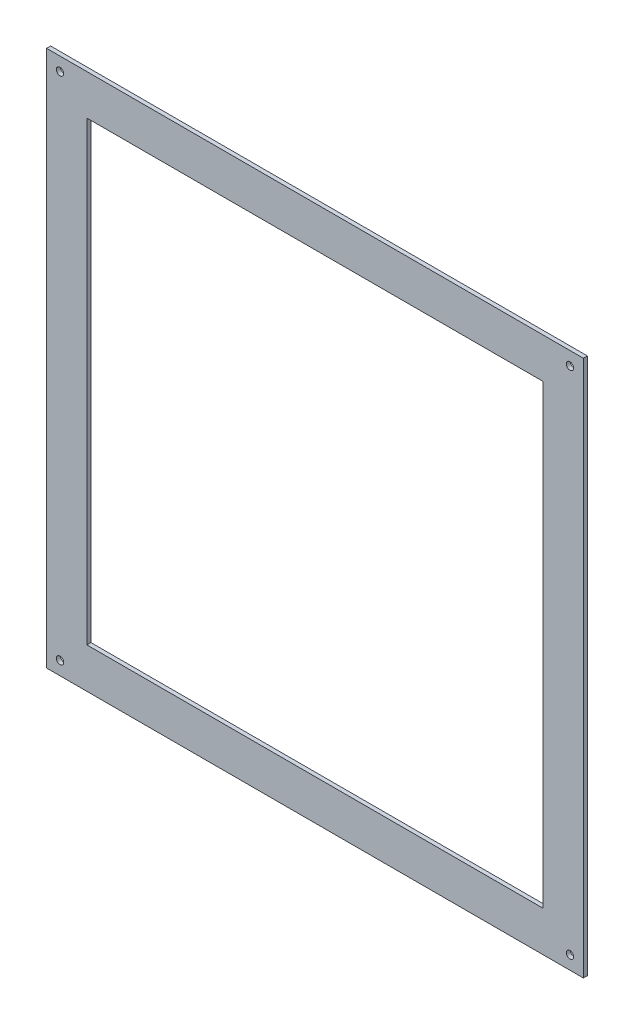
ISO-10303-21;
HEADER;
FILE_DESCRIPTION(('STEP AP214'),'2;1');
FILE_NAME('part.step','',(''),(''),'','','');
FILE_SCHEMA(('AUTOMOTIVE_DESIGN { 1 0 10303 214 1 1 1 1 }'));
ENDSEC;
DATA;
#1=APPLICATION_CONTEXT('core data for automotive mechanical design processes');
#2=APPLICATION_PROTOCOL_DEFINITION('international standard','automotive_design',2000,#1);
#3=PRODUCT_CONTEXT('',#1,'mechanical');
#4=PRODUCT('Part','Part','',(#3));
#5=PRODUCT_RELATED_PRODUCT_CATEGORY('part','',(#4));
#6=PRODUCT_DEFINITION_FORMATION('','',#4);
#7=PRODUCT_DEFINITION_CONTEXT('part definition',#1,'design');
#8=PRODUCT_DEFINITION('design','',#6,#7);
#9=PRODUCT_DEFINITION_SHAPE('','',#8);
#10=(LENGTH_UNIT() NAMED_UNIT(*) SI_UNIT(.MILLI.,.METRE.));
#11=(NAMED_UNIT(*) PLANE_ANGLE_UNIT() SI_UNIT($,.RADIAN.));
#12=(NAMED_UNIT(*) SI_UNIT($,.STERADIAN.) SOLID_ANGLE_UNIT());
#13=UNCERTAINTY_MEASURE_WITH_UNIT(LENGTH_MEASURE(1.E-05),#10,'distance_accuracy_value','');
#14=(GEOMETRIC_REPRESENTATION_CONTEXT(3) GLOBAL_UNCERTAINTY_ASSIGNED_CONTEXT((#13)) GLOBAL_UNIT_ASSIGNED_CONTEXT((#10,
#11,#12)) REPRESENTATION_CONTEXT('',''));
#15=CARTESIAN_POINT('',(0.,0.,0.));
#16=DIRECTION('',(0.,0.,1.));
#17=DIRECTION('',(1.,0.,0.));
#18=AXIS2_PLACEMENT_3D('',#15,#16,#17);
#19=CARTESIAN_POINT('',(0.,0.,3.));
#20=DIRECTION('',(0.,0.,1.));
#21=DIRECTION('',(1.,0.,0.));
#22=AXIS2_PLACEMENT_3D('',#19,#20,#21);
#23=PLANE('',#22);
#24=CARTESIAN_POINT('',(-190.,-190.,3.));
#25=DIRECTION('',(0.,0.,1.));
#26=DIRECTION('',(1.,0.,0.));
#27=AXIS2_PLACEMENT_3D('',#24,#25,#26);
#28=CIRCLE('',#27,2.74999999999997);
#29=CARTESIAN_POINT('',(-187.25,-190.,3.));
#30=VERTEX_POINT('',#29);
#31=EDGE_CURVE('E249',#30,#30,#28,.T.);
#32=ORIENTED_EDGE('',*,*,#31,.F.);
#33=EDGE_LOOP('',(#32));
#34=FACE_BOUND('',#33,.T.);
#35=CARTESIAN_POINT('',(-190.,190.,3.));
#36=DIRECTION('',(0.,0.,1.));
#37=DIRECTION('',(1.,0.,0.));
#38=AXIS2_PLACEMENT_3D('',#35,#36,#37);
#39=CIRCLE('',#38,2.74999999999997);
#40=CARTESIAN_POINT('',(-187.25,190.,3.));
#41=VERTEX_POINT('',#40);
#42=EDGE_CURVE('E251',#41,#41,#39,.T.);
#43=ORIENTED_EDGE('',*,*,#42,.F.);
#44=EDGE_LOOP('',(#43));
#45=FACE_BOUND('',#44,.T.);
#46=CARTESIAN_POINT('',(190.,190.,3.));
#47=DIRECTION('',(0.,0.,1.));
#48=DIRECTION('',(1.,0.,0.));
#49=AXIS2_PLACEMENT_3D('',#46,#47,#48);
#50=CIRCLE('',#49,2.75);
#51=CARTESIAN_POINT('',(192.75,190.,3.));
#52=VERTEX_POINT('',#51);
#53=EDGE_CURVE('E259',#52,#52,#50,.T.);
#54=ORIENTED_EDGE('',*,*,#53,.F.);
#55=EDGE_LOOP('',(#54));
#56=FACE_BOUND('',#55,.T.);
#57=CARTESIAN_POINT('',(190.,-190.,3.));
#58=DIRECTION('',(0.,0.,1.));
#59=DIRECTION('',(1.,0.,0.));
#60=AXIS2_PLACEMENT_3D('',#57,#58,#59);
#61=CIRCLE('',#60,2.75);
#62=CARTESIAN_POINT('',(192.75,-190.,3.));
#63=VERTEX_POINT('',#62);
#64=EDGE_CURVE('E265',#63,#63,#61,.T.);
#65=ORIENTED_EDGE('',*,*,#64,.F.);
#66=EDGE_LOOP('',(#65));
#67=FACE_BOUND('',#66,.T.);
#68=DIRECTION('',(0.,1.,0.));
#69=VECTOR('',#68,1.);
#70=CARTESIAN_POINT('',(200.,200.,3.));
#71=LINE('',#70,#69);
#72=CARTESIAN_POINT('',(200.,-200.,3.));
#73=VERTEX_POINT('',#72);
#74=CARTESIAN_POINT('',(200.,200.,3.));
#75=VERTEX_POINT('',#74);
#76=EDGE_CURVE('E147',#73,#75,#71,.T.);
#77=ORIENTED_EDGE('',*,*,#76,.T.);
#78=DIRECTION('',(-1.,0.,0.));
#79=VECTOR('',#78,1.);
#80=CARTESIAN_POINT('',(-200.,200.,3.));
#81=LINE('',#80,#79);
#82=CARTESIAN_POINT('',(-200.,200.,3.));
#83=VERTEX_POINT('',#82);
#84=EDGE_CURVE('E150',#75,#83,#81,.T.);
#85=ORIENTED_EDGE('',*,*,#84,.T.);
#86=DIRECTION('',(0.,-1.,0.));
#87=VECTOR('',#86,1.);
#88=CARTESIAN_POINT('',(-200.,200.,3.));
#89=LINE('',#88,#87);
#90=CARTESIAN_POINT('',(-200.,-200.,3.));
#91=VERTEX_POINT('',#90);
#92=EDGE_CURVE('E153',#83,#91,#89,.T.);
#93=ORIENTED_EDGE('',*,*,#92,.T.);
#94=DIRECTION('',(1.,0.,0.));
#95=VECTOR('',#94,1.);
#96=CARTESIAN_POINT('',(-200.,-200.,3.));
#97=LINE('',#96,#95);
#98=EDGE_CURVE('E155',#91,#73,#97,.T.);
#99=ORIENTED_EDGE('',*,*,#98,.T.);
#100=EDGE_LOOP('',(#77,#85,#93,#99));
#101=FACE_BOUND('',#100,.T.);
#102=DIRECTION('',(1.,0.,0.));
#103=VECTOR('',#102,1.);
#104=CARTESIAN_POINT('',(170.,-170.,3.));
#105=LINE('',#104,#103);
#106=CARTESIAN_POINT('',(-170.,-170.,3.));
#107=VERTEX_POINT('',#106);
#108=CARTESIAN_POINT('',(170.,-170.,3.));
#109=VERTEX_POINT('',#108);
#110=EDGE_CURVE('E117',#107,#109,#105,.T.);
#111=ORIENTED_EDGE('',*,*,#110,.F.);
#112=DIRECTION('',(0.,-1.,0.));
#113=VECTOR('',#112,1.);
#114=CARTESIAN_POINT('',(-170.,170.,3.));
#115=LINE('',#114,#113);
#116=CARTESIAN_POINT('',(-170.,170.,3.));
#117=VERTEX_POINT('',#116);
#118=EDGE_CURVE('E109',#117,#107,#115,.T.);
#119=ORIENTED_EDGE('',*,*,#118,.F.);
#120=DIRECTION('',(-1.,0.,0.));
#121=VECTOR('',#120,1.);
#122=CARTESIAN_POINT('',(170.,170.,3.));
#123=LINE('',#122,#121);
#124=CARTESIAN_POINT('',(170.,170.,3.));
#125=VERTEX_POINT('',#124);
#126=EDGE_CURVE('E131',#125,#117,#123,.T.);
#127=ORIENTED_EDGE('',*,*,#126,.F.);
#128=DIRECTION('',(0.,1.,0.));
#129=VECTOR('',#128,1.);
#130=CARTESIAN_POINT('',(170.,170.,3.));
#131=LINE('',#130,#129);
#132=EDGE_CURVE('E129',#109,#125,#131,.T.);
#133=ORIENTED_EDGE('',*,*,#132,.F.);
#134=EDGE_LOOP('',(#111,#119,#127,#133));
#135=FACE_BOUND('',#134,.T.);
#136=ADVANCED_FACE('F44',(#34,#45,#56,#67,#101,#135),#23,.T.);
#137=CARTESIAN_POINT('',(0.,0.,0.));
#138=DIRECTION('',(0.,0.,1.));
#139=DIRECTION('',(1.,0.,0.));
#140=AXIS2_PLACEMENT_3D('',#137,#138,#139);
#141=PLANE('',#140);
#142=CARTESIAN_POINT('',(-190.,-190.,0.));
#143=DIRECTION('',(0.,0.,1.));
#144=DIRECTION('',(1.,0.,0.));
#145=AXIS2_PLACEMENT_3D('',#142,#143,#144);
#146=CIRCLE('',#145,2.75);
#147=CARTESIAN_POINT('',(-187.25,-190.,0.));
#148=VERTEX_POINT('',#147);
#149=EDGE_CURVE('E247',#148,#148,#146,.T.);
#150=ORIENTED_EDGE('',*,*,#149,.T.);
#151=EDGE_LOOP('',(#150));
#152=FACE_BOUND('',#151,.T.);
#153=CARTESIAN_POINT('',(-190.,190.,0.));
#154=DIRECTION('',(0.,0.,1.));
#155=DIRECTION('',(1.,0.,0.));
#156=AXIS2_PLACEMENT_3D('',#153,#154,#155);
#157=CIRCLE('',#156,2.75);
#158=CARTESIAN_POINT('',(-187.25,190.,0.));
#159=VERTEX_POINT('',#158);
#160=EDGE_CURVE('E256',#159,#159,#157,.T.);
#161=ORIENTED_EDGE('',*,*,#160,.T.);
#162=EDGE_LOOP('',(#161));
#163=FACE_BOUND('',#162,.T.);
#164=CARTESIAN_POINT('',(190.,190.,0.));
#165=DIRECTION('',(0.,0.,1.));
#166=DIRECTION('',(1.,0.,0.));
#167=AXIS2_PLACEMENT_3D('',#164,#165,#166);
#168=CIRCLE('',#167,2.75);
#169=CARTESIAN_POINT('',(192.75,190.,0.));
#170=VERTEX_POINT('',#169);
#171=EDGE_CURVE('E262',#170,#170,#168,.T.);
#172=ORIENTED_EDGE('',*,*,#171,.T.);
#173=EDGE_LOOP('',(#172));
#174=FACE_BOUND('',#173,.T.);
#175=CARTESIAN_POINT('',(190.,-190.,0.));
#176=DIRECTION('',(0.,0.,1.));
#177=DIRECTION('',(1.,0.,0.));
#178=AXIS2_PLACEMENT_3D('',#175,#176,#177);
#179=CIRCLE('',#178,2.75);
#180=CARTESIAN_POINT('',(192.75,-190.,0.));
#181=VERTEX_POINT('',#180);
#182=EDGE_CURVE('E137',#181,#181,#179,.T.);
#183=ORIENTED_EDGE('',*,*,#182,.T.);
#184=EDGE_LOOP('',(#183));
#185=FACE_BOUND('',#184,.T.);
#186=DIRECTION('',(0.,1.,0.));
#187=VECTOR('',#186,1.);
#188=CARTESIAN_POINT('',(200.,200.,0.));
#189=LINE('',#188,#187);
#190=CARTESIAN_POINT('',(200.,-200.,0.));
#191=VERTEX_POINT('',#190);
#192=CARTESIAN_POINT('',(200.,200.,0.));
#193=VERTEX_POINT('',#192);
#194=EDGE_CURVE('E125',#191,#193,#189,.T.);
#195=ORIENTED_EDGE('',*,*,#194,.F.);
#196=DIRECTION('',(1.,0.,0.));
#197=VECTOR('',#196,1.);
#198=CARTESIAN_POINT('',(-200.,-200.,0.));
#199=LINE('',#198,#197);
#200=CARTESIAN_POINT('',(-200.,-200.,0.));
#201=VERTEX_POINT('',#200);
#202=EDGE_CURVE('E151',#201,#191,#199,.T.);
#203=ORIENTED_EDGE('',*,*,#202,.F.);
#204=DIRECTION('',(0.,-1.,0.));
#205=VECTOR('',#204,1.);
#206=CARTESIAN_POINT('',(-200.,200.,0.));
#207=LINE('',#206,#205);
#208=CARTESIAN_POINT('',(-200.,200.,0.));
#209=VERTEX_POINT('',#208);
#210=EDGE_CURVE('E162',#209,#201,#207,.T.);
#211=ORIENTED_EDGE('',*,*,#210,.F.);
#212=DIRECTION('',(-1.,0.,0.));
#213=VECTOR('',#212,1.);
#214=CARTESIAN_POINT('',(-200.,200.,0.));
#215=LINE('',#214,#213);
#216=EDGE_CURVE('E160',#193,#209,#215,.T.);
#217=ORIENTED_EDGE('',*,*,#216,.F.);
#218=EDGE_LOOP('',(#195,#203,#211,#217));
#219=FACE_BOUND('',#218,.T.);
#220=DIRECTION('',(0.,-1.,0.));
#221=VECTOR('',#220,1.);
#222=CARTESIAN_POINT('',(-170.,170.,0.));
#223=LINE('',#222,#221);
#224=CARTESIAN_POINT('',(-170.,170.,0.));
#225=VERTEX_POINT('',#224);
#226=CARTESIAN_POINT('',(-170.,-170.,0.));
#227=VERTEX_POINT('',#226);
#228=EDGE_CURVE('E67',#225,#227,#223,.T.);
#229=ORIENTED_EDGE('',*,*,#228,.T.);
#230=DIRECTION('',(1.,0.,0.));
#231=VECTOR('',#230,1.);
#232=CARTESIAN_POINT('',(170.,-170.,0.));
#233=LINE('',#232,#231);
#234=CARTESIAN_POINT('',(170.,-170.,0.));
#235=VERTEX_POINT('',#234);
#236=EDGE_CURVE('E124',#227,#235,#233,.T.);
#237=ORIENTED_EDGE('',*,*,#236,.T.);
#238=DIRECTION('',(0.,1.,0.));
#239=VECTOR('',#238,1.);
#240=CARTESIAN_POINT('',(170.,170.,0.));
#241=LINE('',#240,#239);
#242=CARTESIAN_POINT('',(170.,170.,0.));
#243=VERTEX_POINT('',#242);
#244=EDGE_CURVE('E139',#235,#243,#241,.T.);
#245=ORIENTED_EDGE('',*,*,#244,.T.);
#246=DIRECTION('',(-1.,0.,0.));
#247=VECTOR('',#246,1.);
#248=CARTESIAN_POINT('',(170.,170.,0.));
#249=LINE('',#248,#247);
#250=EDGE_CURVE('E118',#243,#225,#249,.T.);
#251=ORIENTED_EDGE('',*,*,#250,.T.);
#252=EDGE_LOOP('',(#229,#237,#245,#251));
#253=FACE_BOUND('',#252,.T.);
#254=ADVANCED_FACE('F180',(#152,#163,#174,#185,#219,#253),#141,.F.);
#255=CARTESIAN_POINT('',(200.,200.,3.));
#256=DIRECTION('',(-1.,0.,0.));
#257=DIRECTION('',(0.,-1.,0.));
#258=AXIS2_PLACEMENT_3D('',#255,#256,#257);
#259=PLANE('',#258);
#260=ORIENTED_EDGE('',*,*,#194,.T.);
#261=DIRECTION('',(0.,0.,-1.));
#262=VECTOR('',#261,1.);
#263=CARTESIAN_POINT('',(200.,200.,3.));
#264=LINE('',#263,#262);
#265=EDGE_CURVE('E13',#75,#193,#264,.T.);
#266=ORIENTED_EDGE('',*,*,#265,.F.);
#267=ORIENTED_EDGE('',*,*,#76,.F.);
#268=DIRECTION('',(0.,0.,-1.));
#269=VECTOR('',#268,1.);
#270=CARTESIAN_POINT('',(200.,-200.,3.));
#271=LINE('',#270,#269);
#272=EDGE_CURVE('E157',#73,#191,#271,.T.);
#273=ORIENTED_EDGE('',*,*,#272,.T.);
#274=EDGE_LOOP('',(#260,#266,#267,#273));
#275=FACE_BOUND('',#274,.T.);
#276=ADVANCED_FACE('F46',(#275),#259,.F.);
#277=CARTESIAN_POINT('',(-200.,200.,3.));
#278=DIRECTION('',(0.,-1.,0.));
#279=DIRECTION('',(0.,0.,-1.));
#280=AXIS2_PLACEMENT_3D('',#277,#278,#279);
#281=PLANE('',#280);
#282=ORIENTED_EDGE('',*,*,#216,.T.);
#283=DIRECTION('',(0.,0.,-1.));
#284=VECTOR('',#283,1.);
#285=CARTESIAN_POINT('',(-200.,200.,3.));
#286=LINE('',#285,#284);
#287=EDGE_CURVE('E52',#83,#209,#286,.T.);
#288=ORIENTED_EDGE('',*,*,#287,.F.);
#289=ORIENTED_EDGE('',*,*,#84,.F.);
#290=ORIENTED_EDGE('',*,*,#265,.T.);
#291=EDGE_LOOP('',(#282,#288,#289,#290));
#292=FACE_BOUND('',#291,.T.);
#293=ADVANCED_FACE('F190',(#292),#281,.F.);
#294=CARTESIAN_POINT('',(-200.,200.,3.));
#295=DIRECTION('',(1.,0.,0.));
#296=DIRECTION('',(0.,1.,0.));
#297=AXIS2_PLACEMENT_3D('',#294,#295,#296);
#298=PLANE('',#297);
#299=ORIENTED_EDGE('',*,*,#210,.T.);
#300=DIRECTION('',(0.,0.,-1.));
#301=VECTOR('',#300,1.);
#302=CARTESIAN_POINT('',(-200.,-200.,3.));
#303=LINE('',#302,#301);
#304=EDGE_CURVE('E167',#91,#201,#303,.T.);
#305=ORIENTED_EDGE('',*,*,#304,.F.);
#306=ORIENTED_EDGE('',*,*,#92,.F.);
#307=ORIENTED_EDGE('',*,*,#287,.T.);
#308=EDGE_LOOP('',(#299,#305,#306,#307));
#309=FACE_BOUND('',#308,.T.);
#310=ADVANCED_FACE('F174',(#309),#298,.F.);
#311=CARTESIAN_POINT('',(-200.,-200.,3.));
#312=DIRECTION('',(0.,1.,0.));
#313=DIRECTION('',(-1.,0.,0.));
#314=AXIS2_PLACEMENT_3D('',#311,#312,#313);
#315=PLANE('',#314);
#316=ORIENTED_EDGE('',*,*,#202,.T.);
#317=ORIENTED_EDGE('',*,*,#272,.F.);
#318=ORIENTED_EDGE('',*,*,#98,.F.);
#319=ORIENTED_EDGE('',*,*,#304,.T.);
#320=EDGE_LOOP('',(#316,#317,#318,#319));
#321=FACE_BOUND('',#320,.T.);
#322=ADVANCED_FACE('F184',(#321),#315,.F.);
#323=CARTESIAN_POINT('',(-170.,170.,3.));
#324=DIRECTION('',(1.,0.,0.));
#325=DIRECTION('',(0.,0.,-1.));
#326=AXIS2_PLACEMENT_3D('',#323,#324,#325);
#327=PLANE('',#326);
#328=ORIENTED_EDGE('',*,*,#228,.F.);
#329=DIRECTION('',(0.,0.,-1.));
#330=VECTOR('',#329,1.);
#331=CARTESIAN_POINT('',(-170.,170.,3.));
#332=LINE('',#331,#330);
#333=EDGE_CURVE('E113',#117,#225,#332,.T.);
#334=ORIENTED_EDGE('',*,*,#333,.F.);
#335=ORIENTED_EDGE('',*,*,#118,.T.);
#336=DIRECTION('',(0.,0.,-1.));
#337=VECTOR('',#336,1.);
#338=CARTESIAN_POINT('',(-170.,-170.,3.));
#339=LINE('',#338,#337);
#340=EDGE_CURVE('E112',#107,#227,#339,.T.);
#341=ORIENTED_EDGE('',*,*,#340,.T.);
#342=EDGE_LOOP('',(#328,#334,#335,#341));
#343=FACE_BOUND('',#342,.T.);
#344=ADVANCED_FACE('F111',(#343),#327,.T.);
#345=CARTESIAN_POINT('',(170.,-170.,3.));
#346=DIRECTION('',(0.,1.,0.));
#347=DIRECTION('',(0.,0.,1.));
#348=AXIS2_PLACEMENT_3D('',#345,#346,#347);
#349=PLANE('',#348);
#350=ORIENTED_EDGE('',*,*,#236,.F.);
#351=ORIENTED_EDGE('',*,*,#340,.F.);
#352=ORIENTED_EDGE('',*,*,#110,.T.);
#353=DIRECTION('',(0.,0.,-1.));
#354=VECTOR('',#353,1.);
#355=CARTESIAN_POINT('',(170.,-170.,3.));
#356=LINE('',#355,#354);
#357=EDGE_CURVE('E126',#109,#235,#356,.T.);
#358=ORIENTED_EDGE('',*,*,#357,.T.);
#359=EDGE_LOOP('',(#350,#351,#352,#358));
#360=FACE_BOUND('',#359,.T.);
#361=ADVANCED_FACE('F121',(#360),#349,.T.);
#362=CARTESIAN_POINT('',(170.,170.,3.));
#363=DIRECTION('',(-1.,0.,0.));
#364=DIRECTION('',(0.,0.,1.));
#365=AXIS2_PLACEMENT_3D('',#362,#363,#364);
#366=PLANE('',#365);
#367=ORIENTED_EDGE('',*,*,#244,.F.);
#368=ORIENTED_EDGE('',*,*,#357,.F.);
#369=ORIENTED_EDGE('',*,*,#132,.T.);
#370=DIRECTION('',(0.,0.,-1.));
#371=VECTOR('',#370,1.);
#372=CARTESIAN_POINT('',(170.,170.,3.));
#373=LINE('',#372,#371);
#374=EDGE_CURVE('E59',#125,#243,#373,.T.);
#375=ORIENTED_EDGE('',*,*,#374,.T.);
#376=EDGE_LOOP('',(#367,#368,#369,#375));
#377=FACE_BOUND('',#376,.T.);
#378=ADVANCED_FACE('F217',(#377),#366,.T.);
#379=CARTESIAN_POINT('',(170.,170.,3.));
#380=DIRECTION('',(0.,-1.,0.));
#381=DIRECTION('',(0.,0.,-1.));
#382=AXIS2_PLACEMENT_3D('',#379,#380,#381);
#383=PLANE('',#382);
#384=ORIENTED_EDGE('',*,*,#250,.F.);
#385=ORIENTED_EDGE('',*,*,#374,.F.);
#386=ORIENTED_EDGE('',*,*,#126,.T.);
#387=ORIENTED_EDGE('',*,*,#333,.T.);
#388=EDGE_LOOP('',(#384,#385,#386,#387));
#389=FACE_BOUND('',#388,.T.);
#390=ADVANCED_FACE('F221',(#389),#383,.T.);
#391=CARTESIAN_POINT('',(190.,-190.,3.));
#392=DIRECTION('',(0.,0.,1.));
#393=DIRECTION('',(1.,0.,0.));
#394=AXIS2_PLACEMENT_3D('',#391,#392,#393);
#395=CYLINDRICAL_SURFACE('',#394,2.75);
#396=ORIENTED_EDGE('',*,*,#182,.F.);
#397=EDGE_LOOP('',(#396));
#398=FACE_BOUND('',#397,.T.);
#399=ORIENTED_EDGE('',*,*,#64,.T.);
#400=EDGE_LOOP('',(#399));
#401=FACE_BOUND('',#400,.T.);
#402=ADVANCED_FACE('F227',(#398,#401),#395,.F.);
#403=CARTESIAN_POINT('',(190.,190.,3.));
#404=DIRECTION('',(0.,0.,1.));
#405=DIRECTION('',(1.,0.,0.));
#406=AXIS2_PLACEMENT_3D('',#403,#404,#405);
#407=CYLINDRICAL_SURFACE('',#406,2.75);
#408=ORIENTED_EDGE('',*,*,#171,.F.);
#409=EDGE_LOOP('',(#408));
#410=FACE_BOUND('',#409,.T.);
#411=ORIENTED_EDGE('',*,*,#53,.T.);
#412=EDGE_LOOP('',(#411));
#413=FACE_BOUND('',#412,.T.);
#414=ADVANCED_FACE('F230',(#410,#413),#407,.F.);
#415=CARTESIAN_POINT('',(-190.,190.,3.));
#416=DIRECTION('',(0.,0.,1.));
#417=DIRECTION('',(1.,0.,0.));
#418=AXIS2_PLACEMENT_3D('',#415,#416,#417);
#419=CYLINDRICAL_SURFACE('',#418,2.74999999999999);
#420=ORIENTED_EDGE('',*,*,#160,.F.);
#421=EDGE_LOOP('',(#420));
#422=FACE_BOUND('',#421,.T.);
#423=ORIENTED_EDGE('',*,*,#42,.T.);
#424=EDGE_LOOP('',(#423));
#425=FACE_BOUND('',#424,.T.);
#426=ADVANCED_FACE('F234',(#422,#425),#419,.F.);
#427=CARTESIAN_POINT('',(-190.,-190.,3.));
#428=DIRECTION('',(0.,0.,1.));
#429=DIRECTION('',(1.,0.,0.));
#430=AXIS2_PLACEMENT_3D('',#427,#428,#429);
#431=CYLINDRICAL_SURFACE('',#430,2.74999999999999);
#432=ORIENTED_EDGE('',*,*,#149,.F.);
#433=EDGE_LOOP('',(#432));
#434=FACE_BOUND('',#433,.T.);
#435=ORIENTED_EDGE('',*,*,#31,.T.);
#436=EDGE_LOOP('',(#435));
#437=FACE_BOUND('',#436,.T.);
#438=ADVANCED_FACE('F238',(#434,#437),#431,.F.);
#439=CLOSED_SHELL('',(#136,#254,#276,#293,#310,#322,#344,#361,#378,#390,#402,#414,#426,#438));
#440=MANIFOLD_SOLID_BREP('B2',#439);
#441=ADVANCED_BREP_SHAPE_REPRESENTATION('',(#18,#440),#14);
#442=SHAPE_DEFINITION_REPRESENTATION(#9,#441);
ENDSEC;
END-ISO-10303-21;
